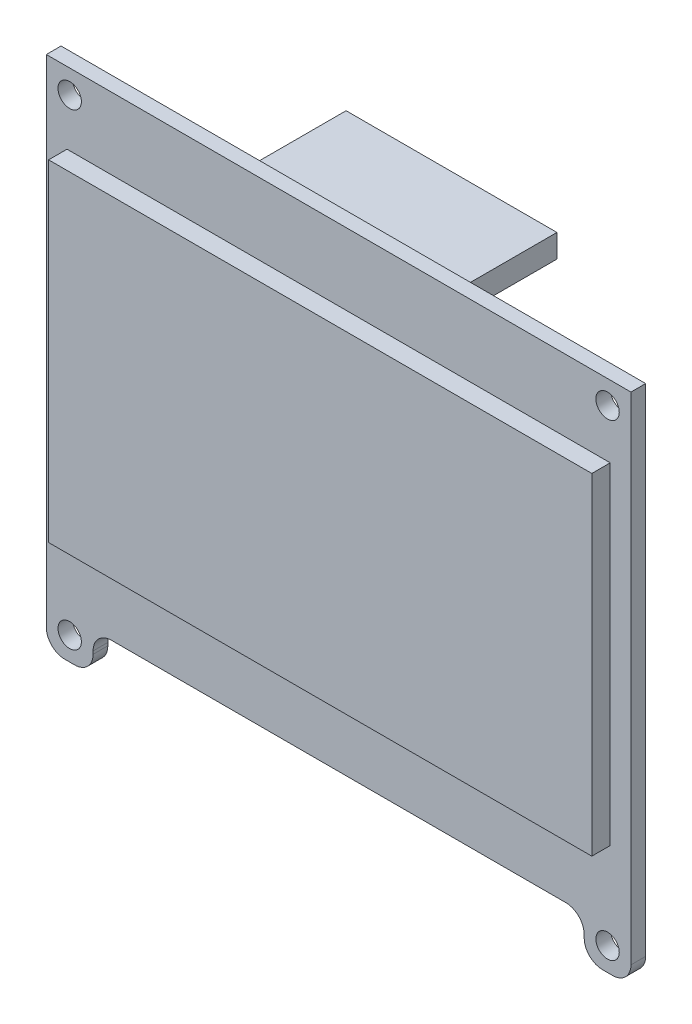
ISO-10303-21;
HEADER;
FILE_DESCRIPTION(('STEP AP214'),'2;1');
FILE_NAME('part.step','',(''),(''),'','','');
FILE_SCHEMA(('AUTOMOTIVE_DESIGN { 1 0 10303 214 1 1 1 1 }'));
ENDSEC;
DATA;
#1=APPLICATION_CONTEXT('core data for automotive mechanical design processes');
#2=APPLICATION_PROTOCOL_DEFINITION('international standard','automotive_design',2000,#1);
#3=PRODUCT_CONTEXT('',#1,'mechanical');
#4=PRODUCT('Part','Part','',(#3));
#5=PRODUCT_RELATED_PRODUCT_CATEGORY('part','',(#4));
#6=PRODUCT_DEFINITION_FORMATION('','',#4);
#7=PRODUCT_DEFINITION_CONTEXT('part definition',#1,'design');
#8=PRODUCT_DEFINITION('design','',#6,#7);
#9=PRODUCT_DEFINITION_SHAPE('','',#8);
#10=(LENGTH_UNIT() NAMED_UNIT(*) SI_UNIT(.MILLI.,.METRE.));
#11=(NAMED_UNIT(*) PLANE_ANGLE_UNIT() SI_UNIT($,.RADIAN.));
#12=(NAMED_UNIT(*) SI_UNIT($,.STERADIAN.) SOLID_ANGLE_UNIT());
#13=UNCERTAINTY_MEASURE_WITH_UNIT(LENGTH_MEASURE(1.E-05),#10,'distance_accuracy_value','');
#14=(GEOMETRIC_REPRESENTATION_CONTEXT(3) GLOBAL_UNCERTAINTY_ASSIGNED_CONTEXT((#13)) GLOBAL_UNIT_ASSIGNED_CONTEXT((#10,
#11,#12)) REPRESENTATION_CONTEXT('',''));
#15=CARTESIAN_POINT('',(0.,0.,0.));
#16=DIRECTION('',(0.,0.,1.));
#17=DIRECTION('',(1.,0.,0.));
#18=AXIS2_PLACEMENT_3D('',#15,#16,#17);
#19=CARTESIAN_POINT('',(0.,0.,0.));
#20=DIRECTION('',(0.,0.,1.));
#21=DIRECTION('',(1.,0.,0.));
#22=AXIS2_PLACEMENT_3D('',#19,#20,#21);
#23=PLANE('',#22);
#24=DIRECTION('',(0.,-1.,0.));
#25=VECTOR('',#24,1.);
#26=CARTESIAN_POINT('',(0.,0.,0.));
#27=LINE('',#26,#25);
#28=CARTESIAN_POINT('',(0.,0.,0.));
#29=VERTEX_POINT('',#28);
#30=CARTESIAN_POINT('',(0.,-53.88,0.));
#31=VERTEX_POINT('',#30);
#32=EDGE_CURVE('E352',#29,#31,#27,.T.);
#33=ORIENTED_EDGE('',*,*,#32,.F.);
#34=DIRECTION('',(1.,0.,0.));
#35=VECTOR('',#34,1.);
#36=CARTESIAN_POINT('',(0.,0.,0.));
#37=LINE('',#36,#35);
#38=CARTESIAN_POINT('',(63.5,0.,0.));
#39=VERTEX_POINT('',#38);
#40=EDGE_CURVE('E277',#29,#39,#37,.T.);
#41=ORIENTED_EDGE('',*,*,#40,.T.);
#42=DIRECTION('',(0.,-1.,0.));
#43=VECTOR('',#42,1.);
#44=CARTESIAN_POINT('',(63.5,0.,0.));
#45=LINE('',#44,#43);
#46=CARTESIAN_POINT('',(63.5,-53.88,0.));
#47=VERTEX_POINT('',#46);
#48=EDGE_CURVE('E394',#39,#47,#45,.T.);
#49=ORIENTED_EDGE('',*,*,#48,.T.);
#50=CARTESIAN_POINT('',(61.5,-53.88,0.));
#51=DIRECTION('',(0.,0.,1.));
#52=DIRECTION('',(1.,0.,0.));
#53=AXIS2_PLACEMENT_3D('',#50,#51,#52);
#54=CIRCLE('',#53,2.);
#55=CARTESIAN_POINT('',(61.5,-55.88,0.));
#56=VERTEX_POINT('',#55);
#57=EDGE_CURVE('E386',#56,#47,#54,.T.);
#58=ORIENTED_EDGE('',*,*,#57,.F.);
#59=DIRECTION('',(1.,0.,0.));
#60=VECTOR('',#59,1.);
#61=CARTESIAN_POINT('',(0.,-55.88,0.));
#62=LINE('',#61,#60);
#63=CARTESIAN_POINT('',(60.42,-55.88,0.));
#64=VERTEX_POINT('',#63);
#65=EDGE_CURVE('E387',#64,#56,#62,.T.);
#66=ORIENTED_EDGE('',*,*,#65,.F.);
#67=CARTESIAN_POINT('',(60.42,-53.88,0.));
#68=DIRECTION('',(0.,0.,1.));
#69=DIRECTION('',(1.,0.,0.));
#70=AXIS2_PLACEMENT_3D('',#67,#68,#69);
#71=CIRCLE('',#70,2.);
#72=CARTESIAN_POINT('',(58.42,-53.88,0.));
#73=VERTEX_POINT('',#72);
#74=EDGE_CURVE('E382',#73,#64,#71,.T.);
#75=ORIENTED_EDGE('',*,*,#74,.F.);
#76=DIRECTION('',(0.,1.,0.));
#77=VECTOR('',#76,1.);
#78=CARTESIAN_POINT('',(58.42,0.,0.));
#79=LINE('',#78,#77);
#80=CARTESIAN_POINT('',(58.42,-53.562,0.));
#81=VERTEX_POINT('',#80);
#82=EDGE_CURVE('E377',#73,#81,#79,.T.);
#83=ORIENTED_EDGE('',*,*,#82,.T.);
#84=CARTESIAN_POINT('',(56.42,-53.562,0.));
#85=DIRECTION('',(0.,0.,1.));
#86=DIRECTION('',(1.,0.,0.));
#87=AXIS2_PLACEMENT_3D('',#84,#85,#86);
#88=CIRCLE('',#87,2.);
#89=CARTESIAN_POINT('',(56.42,-51.562,0.));
#90=VERTEX_POINT('',#89);
#91=EDGE_CURVE('E374',#90,#81,#88,.F.);
#92=ORIENTED_EDGE('',*,*,#91,.F.);
#93=DIRECTION('',(1.,0.,0.));
#94=VECTOR('',#93,1.);
#95=CARTESIAN_POINT('',(0.,-51.562,0.));
#96=LINE('',#95,#94);
#97=CARTESIAN_POINT('',(7.08000000000002,-51.562,0.));
#98=VERTEX_POINT('',#97);
#99=EDGE_CURVE('E375',#98,#90,#96,.T.);
#100=ORIENTED_EDGE('',*,*,#99,.F.);
#101=CARTESIAN_POINT('',(7.08,-53.562,0.));
#102=DIRECTION('',(0.,0.,1.));
#103=DIRECTION('',(1.,0.,0.));
#104=AXIS2_PLACEMENT_3D('',#101,#102,#103);
#105=CIRCLE('',#104,2.);
#106=CARTESIAN_POINT('',(5.08,-53.562,0.));
#107=VERTEX_POINT('',#106);
#108=EDGE_CURVE('E369',#107,#98,#105,.F.);
#109=ORIENTED_EDGE('',*,*,#108,.F.);
#110=DIRECTION('',(0.,1.,0.));
#111=VECTOR('',#110,1.);
#112=CARTESIAN_POINT('',(5.08,0.,0.));
#113=LINE('',#112,#111);
#114=CARTESIAN_POINT('',(5.08,-53.88,0.));
#115=VERTEX_POINT('',#114);
#116=EDGE_CURVE('E368',#115,#107,#113,.T.);
#117=ORIENTED_EDGE('',*,*,#116,.F.);
#118=CARTESIAN_POINT('',(3.08,-53.88,0.));
#119=DIRECTION('',(0.,0.,1.));
#120=DIRECTION('',(1.,0.,0.));
#121=AXIS2_PLACEMENT_3D('',#118,#119,#120);
#122=CIRCLE('',#121,2.);
#123=CARTESIAN_POINT('',(3.07999999999999,-55.88,0.));
#124=VERTEX_POINT('',#123);
#125=EDGE_CURVE('E362',#115,#124,#122,.F.);
#126=ORIENTED_EDGE('',*,*,#125,.T.);
#127=DIRECTION('',(1.,0.,0.));
#128=VECTOR('',#127,1.);
#129=CARTESIAN_POINT('',(0.,-55.88,0.));
#130=LINE('',#129,#128);
#131=CARTESIAN_POINT('',(2.00000000000002,-55.88,0.));
#132=VERTEX_POINT('',#131);
#133=EDGE_CURVE('E356',#132,#124,#130,.T.);
#134=ORIENTED_EDGE('',*,*,#133,.F.);
#135=CARTESIAN_POINT('',(2.00000000000001,-53.88,0.));
#136=DIRECTION('',(0.,0.,1.));
#137=DIRECTION('',(1.,0.,0.));
#138=AXIS2_PLACEMENT_3D('',#135,#136,#137);
#139=CIRCLE('',#138,2.);
#140=EDGE_CURVE('E353',#31,#132,#139,.T.);
#141=ORIENTED_EDGE('',*,*,#140,.F.);
#142=EDGE_LOOP('',(#33,#41,#49,#58,#66,#75,#83,#92,#100,#109,#117,#126,#134,#141));
#143=FACE_BOUND('',#142,.T.);
#144=CARTESIAN_POINT('',(2.54000000000001,-53.34,0.));
#145=DIRECTION('',(0.,0.,1.));
#146=DIRECTION('',(1.,0.,0.));
#147=AXIS2_PLACEMENT_3D('',#144,#145,#146);
#148=CIRCLE('',#147,1.27);
#149=CARTESIAN_POINT('',(3.81000000000001,-53.34,0.));
#150=VERTEX_POINT('',#149);
#151=EDGE_CURVE('E350',#150,#150,#148,.T.);
#152=ORIENTED_EDGE('',*,*,#151,.T.);
#153=EDGE_LOOP('',(#152));
#154=FACE_BOUND('',#153,.T.);
#155=CARTESIAN_POINT('',(60.96,-53.34,0.));
#156=DIRECTION('',(0.,0.,1.));
#157=DIRECTION('',(1.,0.,0.));
#158=AXIS2_PLACEMENT_3D('',#155,#156,#157);
#159=CIRCLE('',#158,1.26999999999999);
#160=CARTESIAN_POINT('',(62.23,-53.34,0.));
#161=VERTEX_POINT('',#160);
#162=EDGE_CURVE('E341',#161,#161,#159,.T.);
#163=ORIENTED_EDGE('',*,*,#162,.T.);
#164=EDGE_LOOP('',(#163));
#165=FACE_BOUND('',#164,.T.);
#166=CARTESIAN_POINT('',(60.96,-2.54,0.));
#167=DIRECTION('',(0.,0.,1.));
#168=DIRECTION('',(1.,0.,0.));
#169=AXIS2_PLACEMENT_3D('',#166,#167,#168);
#170=CIRCLE('',#169,1.26999999999999);
#171=CARTESIAN_POINT('',(62.23,-2.54,0.));
#172=VERTEX_POINT('',#171);
#173=EDGE_CURVE('E336',#172,#172,#170,.T.);
#174=ORIENTED_EDGE('',*,*,#173,.T.);
#175=EDGE_LOOP('',(#174));
#176=FACE_BOUND('',#175,.T.);
#177=CARTESIAN_POINT('',(2.54000000000001,-2.54,0.));
#178=DIRECTION('',(0.,0.,1.));
#179=DIRECTION('',(1.,0.,0.));
#180=AXIS2_PLACEMENT_3D('',#177,#178,#179);
#181=CIRCLE('',#180,1.27);
#182=CARTESIAN_POINT('',(3.81000000000001,-2.54,0.));
#183=VERTEX_POINT('',#182);
#184=EDGE_CURVE('E269',#183,#183,#181,.T.);
#185=ORIENTED_EDGE('',*,*,#184,.T.);
#186=EDGE_LOOP('',(#185));
#187=FACE_BOUND('',#186,.T.);
#188=DIRECTION('',(0.,1.,0.));
#189=VECTOR('',#188,1.);
#190=CARTESIAN_POINT('',(20.3,-1.26637928800232,0.));
#191=LINE('',#190,#189);
#192=CARTESIAN_POINT('',(20.3,-3.77637928800232,0.));
#193=VERTEX_POINT('',#192);
#194=CARTESIAN_POINT('',(20.3,-1.26637928800232,0.));
#195=VERTEX_POINT('',#194);
#196=EDGE_CURVE('E64',#193,#195,#191,.T.);
#197=ORIENTED_EDGE('',*,*,#196,.F.);
#198=DIRECTION('',(-1.,0.,0.));
#199=VECTOR('',#198,1.);
#200=CARTESIAN_POINT('',(43.2,-3.77637928800232,0.));
#201=LINE('',#200,#199);
#202=CARTESIAN_POINT('',(43.2,-3.77637928800232,0.));
#203=VERTEX_POINT('',#202);
#204=EDGE_CURVE('E70',#203,#193,#201,.T.);
#205=ORIENTED_EDGE('',*,*,#204,.F.);
#206=DIRECTION('',(0.,-1.,0.));
#207=VECTOR('',#206,1.);
#208=CARTESIAN_POINT('',(43.2,-1.26637928800232,0.));
#209=LINE('',#208,#207);
#210=CARTESIAN_POINT('',(43.2,-1.26637928800232,0.));
#211=VERTEX_POINT('',#210);
#212=EDGE_CURVE('E718',#211,#203,#209,.T.);
#213=ORIENTED_EDGE('',*,*,#212,.F.);
#214=DIRECTION('',(1.,0.,0.));
#215=VECTOR('',#214,1.);
#216=CARTESIAN_POINT('',(43.2,-1.26637928800232,0.));
#217=LINE('',#216,#215);
#218=EDGE_CURVE('E727',#195,#211,#217,.T.);
#219=ORIENTED_EDGE('',*,*,#218,.F.);
#220=EDGE_LOOP('',(#197,#205,#213,#219));
#221=FACE_BOUND('',#220,.T.);
#222=ADVANCED_FACE('F50',(#143,#154,#165,#176,#187,#221),#23,.F.);
#223=CARTESIAN_POINT('',(0.,0.,1.6));
#224=DIRECTION('',(1.,0.,0.));
#225=DIRECTION('',(0.,1.,0.));
#226=AXIS2_PLACEMENT_3D('',#223,#224,#225);
#227=PLANE('',#226);
#228=ORIENTED_EDGE('',*,*,#32,.T.);
#229=DIRECTION('',(0.,0.,-1.));
#230=VECTOR('',#229,1.);
#231=CARTESIAN_POINT('',(0.,-53.88,1.6));
#232=LINE('',#231,#230);
#233=CARTESIAN_POINT('',(0.,-53.88,1.6));
#234=VERTEX_POINT('',#233);
#235=EDGE_CURVE('E12',#234,#31,#232,.T.);
#236=ORIENTED_EDGE('',*,*,#235,.F.);
#237=DIRECTION('',(0.,-1.,0.));
#238=VECTOR('',#237,1.);
#239=CARTESIAN_POINT('',(0.,0.,1.6));
#240=LINE('',#239,#238);
#241=CARTESIAN_POINT('',(0.,0.,1.6));
#242=VERTEX_POINT('',#241);
#243=EDGE_CURVE('E286',#242,#234,#240,.T.);
#244=ORIENTED_EDGE('',*,*,#243,.F.);
#245=DIRECTION('',(0.,0.,-1.));
#246=VECTOR('',#245,1.);
#247=CARTESIAN_POINT('',(0.,0.,1.6));
#248=LINE('',#247,#246);
#249=EDGE_CURVE('E333',#242,#29,#248,.T.);
#250=ORIENTED_EDGE('',*,*,#249,.T.);
#251=EDGE_LOOP('',(#228,#236,#244,#250));
#252=FACE_BOUND('',#251,.T.);
#253=ADVANCED_FACE('F468',(#252),#227,.F.);
#254=CARTESIAN_POINT('',(2.00000000000001,-53.88,1.6));
#255=DIRECTION('',(0.,0.,-1.));
#256=DIRECTION('',(-1.,0.,0.));
#257=AXIS2_PLACEMENT_3D('',#254,#255,#256);
#258=CYLINDRICAL_SURFACE('',#257,2.);
#259=ORIENTED_EDGE('',*,*,#140,.T.);
#260=DIRECTION('',(0.,0.,-1.));
#261=VECTOR('',#260,1.);
#262=CARTESIAN_POINT('',(2.00000000000002,-55.88,1.6));
#263=LINE('',#262,#261);
#264=CARTESIAN_POINT('',(2.00000000000002,-55.88,1.6));
#265=VERTEX_POINT('',#264);
#266=EDGE_CURVE('E57',#265,#132,#263,.T.);
#267=ORIENTED_EDGE('',*,*,#266,.F.);
#268=CARTESIAN_POINT('',(2.00000000000001,-53.88,1.6));
#269=DIRECTION('',(0.,0.,1.));
#270=DIRECTION('',(1.,0.,0.));
#271=AXIS2_PLACEMENT_3D('',#268,#269,#270);
#272=CIRCLE('',#271,2.);
#273=EDGE_CURVE('E295',#234,#265,#272,.T.);
#274=ORIENTED_EDGE('',*,*,#273,.F.);
#275=ORIENTED_EDGE('',*,*,#235,.T.);
#276=EDGE_LOOP('',(#259,#267,#274,#275));
#277=FACE_BOUND('',#276,.T.);
#278=ADVANCED_FACE('F461',(#277),#258,.T.);
#279=CARTESIAN_POINT('',(0.,-55.88,1.6));
#280=DIRECTION('',(0.,1.,0.));
#281=DIRECTION('',(0.,0.,1.));
#282=AXIS2_PLACEMENT_3D('',#279,#280,#281);
#283=PLANE('',#282);
#284=ORIENTED_EDGE('',*,*,#133,.T.);
#285=DIRECTION('',(0.,0.,-1.));
#286=VECTOR('',#285,1.);
#287=CARTESIAN_POINT('',(3.07999999999999,-55.88,1.6));
#288=LINE('',#287,#286);
#289=CARTESIAN_POINT('',(3.07999999999999,-55.88,1.6));
#290=VERTEX_POINT('',#289);
#291=EDGE_CURVE('E440',#290,#124,#288,.T.);
#292=ORIENTED_EDGE('',*,*,#291,.F.);
#293=DIRECTION('',(1.,0.,0.));
#294=VECTOR('',#293,1.);
#295=CARTESIAN_POINT('',(0.,-55.88,1.6));
#296=LINE('',#295,#294);
#297=EDGE_CURVE('E293',#265,#290,#296,.T.);
#298=ORIENTED_EDGE('',*,*,#297,.F.);
#299=ORIENTED_EDGE('',*,*,#266,.T.);
#300=EDGE_LOOP('',(#284,#292,#298,#299));
#301=FACE_BOUND('',#300,.T.);
#302=ADVANCED_FACE('F443',(#301),#283,.F.);
#303=CARTESIAN_POINT('',(3.08,-53.88,1.6));
#304=DIRECTION('',(0.,0.,-1.));
#305=DIRECTION('',(-1.,0.,0.));
#306=AXIS2_PLACEMENT_3D('',#303,#304,#305);
#307=CYLINDRICAL_SURFACE('',#306,2.);
#308=ORIENTED_EDGE('',*,*,#125,.F.);
#309=DIRECTION('',(0.,0.,-1.));
#310=VECTOR('',#309,1.);
#311=CARTESIAN_POINT('',(5.08,-53.88,1.6));
#312=LINE('',#311,#310);
#313=CARTESIAN_POINT('',(5.08,-53.88,1.6));
#314=VERTEX_POINT('',#313);
#315=EDGE_CURVE('E432',#314,#115,#312,.T.);
#316=ORIENTED_EDGE('',*,*,#315,.F.);
#317=CARTESIAN_POINT('',(3.08,-53.88,1.6));
#318=DIRECTION('',(0.,0.,1.));
#319=DIRECTION('',(1.,0.,0.));
#320=AXIS2_PLACEMENT_3D('',#317,#318,#319);
#321=CIRCLE('',#320,2.);
#322=EDGE_CURVE('E299',#314,#290,#321,.F.);
#323=ORIENTED_EDGE('',*,*,#322,.T.);
#324=ORIENTED_EDGE('',*,*,#291,.T.);
#325=EDGE_LOOP('',(#308,#316,#323,#324));
#326=FACE_BOUND('',#325,.T.);
#327=ADVANCED_FACE('F452',(#326),#307,.T.);
#328=CARTESIAN_POINT('',(5.08,0.,1.6));
#329=DIRECTION('',(-1.,0.,0.));
#330=DIRECTION('',(0.,0.,1.));
#331=AXIS2_PLACEMENT_3D('',#328,#329,#330);
#332=PLANE('',#331);
#333=ORIENTED_EDGE('',*,*,#116,.T.);
#334=DIRECTION('',(0.,0.,-1.));
#335=VECTOR('',#334,1.);
#336=CARTESIAN_POINT('',(5.08,-53.562,1.6));
#337=LINE('',#336,#335);
#338=CARTESIAN_POINT('',(5.08,-53.562,1.6));
#339=VERTEX_POINT('',#338);
#340=EDGE_CURVE('E429',#339,#107,#337,.T.);
#341=ORIENTED_EDGE('',*,*,#340,.F.);
#342=DIRECTION('',(0.,1.,0.));
#343=VECTOR('',#342,1.);
#344=CARTESIAN_POINT('',(5.08,0.,1.6));
#345=LINE('',#344,#343);
#346=EDGE_CURVE('E305',#314,#339,#345,.T.);
#347=ORIENTED_EDGE('',*,*,#346,.F.);
#348=ORIENTED_EDGE('',*,*,#315,.T.);
#349=EDGE_LOOP('',(#333,#341,#347,#348));
#350=FACE_BOUND('',#349,.T.);
#351=ADVANCED_FACE('F506',(#350),#332,.F.);
#352=CARTESIAN_POINT('',(7.08,-53.562,1.6));
#353=DIRECTION('',(0.,0.,-1.));
#354=DIRECTION('',(-1.,0.,0.));
#355=AXIS2_PLACEMENT_3D('',#352,#353,#354);
#356=CYLINDRICAL_SURFACE('',#355,2.);
#357=ORIENTED_EDGE('',*,*,#108,.T.);
#358=DIRECTION('',(0.,0.,-1.));
#359=VECTOR('',#358,1.);
#360=CARTESIAN_POINT('',(7.08000000000002,-51.562,1.6));
#361=LINE('',#360,#359);
#362=CARTESIAN_POINT('',(7.08000000000002,-51.562,1.6));
#363=VERTEX_POINT('',#362);
#364=EDGE_CURVE('E426',#363,#98,#361,.T.);
#365=ORIENTED_EDGE('',*,*,#364,.F.);
#366=CARTESIAN_POINT('',(7.08,-53.562,1.6));
#367=DIRECTION('',(0.,0.,1.));
#368=DIRECTION('',(1.,0.,0.));
#369=AXIS2_PLACEMENT_3D('',#366,#367,#368);
#370=CIRCLE('',#369,2.);
#371=EDGE_CURVE('E302',#339,#363,#370,.F.);
#372=ORIENTED_EDGE('',*,*,#371,.F.);
#373=ORIENTED_EDGE('',*,*,#340,.T.);
#374=EDGE_LOOP('',(#357,#365,#372,#373));
#375=FACE_BOUND('',#374,.T.);
#376=ADVANCED_FACE('F508',(#375),#356,.F.);
#377=CARTESIAN_POINT('',(0.,-51.562,1.6));
#378=DIRECTION('',(0.,1.,0.));
#379=DIRECTION('',(0.,0.,1.));
#380=AXIS2_PLACEMENT_3D('',#377,#378,#379);
#381=PLANE('',#380);
#382=ORIENTED_EDGE('',*,*,#99,.T.);
#383=DIRECTION('',(0.,0.,-1.));
#384=VECTOR('',#383,1.);
#385=CARTESIAN_POINT('',(56.42,-51.562,1.6));
#386=LINE('',#385,#384);
#387=CARTESIAN_POINT('',(56.42,-51.562,1.6));
#388=VERTEX_POINT('',#387);
#389=EDGE_CURVE('E425',#388,#90,#386,.T.);
#390=ORIENTED_EDGE('',*,*,#389,.F.);
#391=DIRECTION('',(1.,0.,0.));
#392=VECTOR('',#391,1.);
#393=CARTESIAN_POINT('',(0.,-51.562,1.6));
#394=LINE('',#393,#392);
#395=EDGE_CURVE('E306',#363,#388,#394,.T.);
#396=ORIENTED_EDGE('',*,*,#395,.F.);
#397=ORIENTED_EDGE('',*,*,#364,.T.);
#398=EDGE_LOOP('',(#382,#390,#396,#397));
#399=FACE_BOUND('',#398,.T.);
#400=ADVANCED_FACE('F502',(#399),#381,.F.);
#401=CARTESIAN_POINT('',(56.42,-53.562,1.6));
#402=DIRECTION('',(0.,0.,-1.));
#403=DIRECTION('',(-1.,0.,0.));
#404=AXIS2_PLACEMENT_3D('',#401,#402,#403);
#405=CYLINDRICAL_SURFACE('',#404,2.);
#406=ORIENTED_EDGE('',*,*,#91,.T.);
#407=DIRECTION('',(0.,0.,-1.));
#408=VECTOR('',#407,1.);
#409=CARTESIAN_POINT('',(58.42,-53.562,1.6));
#410=LINE('',#409,#408);
#411=CARTESIAN_POINT('',(58.42,-53.562,1.6));
#412=VERTEX_POINT('',#411);
#413=EDGE_CURVE('E420',#412,#81,#410,.T.);
#414=ORIENTED_EDGE('',*,*,#413,.F.);
#415=CARTESIAN_POINT('',(56.42,-53.562,1.6));
#416=DIRECTION('',(0.,0.,1.));
#417=DIRECTION('',(1.,0.,0.));
#418=AXIS2_PLACEMENT_3D('',#415,#416,#417);
#419=CIRCLE('',#418,2.);
#420=EDGE_CURVE('E313',#388,#412,#419,.F.);
#421=ORIENTED_EDGE('',*,*,#420,.F.);
#422=ORIENTED_EDGE('',*,*,#389,.T.);
#423=EDGE_LOOP('',(#406,#414,#421,#422));
#424=FACE_BOUND('',#423,.T.);
#425=ADVANCED_FACE('F500',(#424),#405,.F.);
#426=CARTESIAN_POINT('',(58.42,0.,1.6));
#427=DIRECTION('',(-1.,0.,0.));
#428=DIRECTION('',(0.,0.,1.));
#429=AXIS2_PLACEMENT_3D('',#426,#427,#428);
#430=PLANE('',#429);
#431=ORIENTED_EDGE('',*,*,#82,.F.);
#432=DIRECTION('',(0.,0.,-1.));
#433=VECTOR('',#432,1.);
#434=CARTESIAN_POINT('',(58.42,-53.88,1.6));
#435=LINE('',#434,#433);
#436=CARTESIAN_POINT('',(58.42,-53.88,1.6));
#437=VERTEX_POINT('',#436);
#438=EDGE_CURVE('E418',#437,#73,#435,.T.);
#439=ORIENTED_EDGE('',*,*,#438,.F.);
#440=DIRECTION('',(0.,1.,0.));
#441=VECTOR('',#440,1.);
#442=CARTESIAN_POINT('',(58.42,0.,1.6));
#443=LINE('',#442,#441);
#444=EDGE_CURVE('E314',#437,#412,#443,.T.);
#445=ORIENTED_EDGE('',*,*,#444,.T.);
#446=ORIENTED_EDGE('',*,*,#413,.T.);
#447=EDGE_LOOP('',(#431,#439,#445,#446));
#448=FACE_BOUND('',#447,.T.);
#449=ADVANCED_FACE('F492',(#448),#430,.T.);
#450=CARTESIAN_POINT('',(60.42,-53.88,1.6));
#451=DIRECTION('',(0.,0.,-1.));
#452=DIRECTION('',(-1.,0.,0.));
#453=AXIS2_PLACEMENT_3D('',#450,#451,#452);
#454=CYLINDRICAL_SURFACE('',#453,2.);
#455=ORIENTED_EDGE('',*,*,#74,.T.);
#456=DIRECTION('',(0.,0.,-1.));
#457=VECTOR('',#456,1.);
#458=CARTESIAN_POINT('',(60.42,-55.88,1.6));
#459=LINE('',#458,#457);
#460=CARTESIAN_POINT('',(60.42,-55.88,1.6));
#461=VERTEX_POINT('',#460);
#462=EDGE_CURVE('E415',#461,#64,#459,.T.);
#463=ORIENTED_EDGE('',*,*,#462,.F.);
#464=CARTESIAN_POINT('',(60.42,-53.88,1.6));
#465=DIRECTION('',(0.,0.,1.));
#466=DIRECTION('',(1.,0.,0.));
#467=AXIS2_PLACEMENT_3D('',#464,#465,#466);
#468=CIRCLE('',#467,2.);
#469=EDGE_CURVE('E318',#437,#461,#468,.T.);
#470=ORIENTED_EDGE('',*,*,#469,.F.);
#471=ORIENTED_EDGE('',*,*,#438,.T.);
#472=EDGE_LOOP('',(#455,#463,#470,#471));
#473=FACE_BOUND('',#472,.T.);
#474=ADVANCED_FACE('F488',(#473),#454,.T.);
#475=CARTESIAN_POINT('',(0.,-55.88,1.6));
#476=DIRECTION('',(0.,1.,0.));
#477=DIRECTION('',(0.,0.,1.));
#478=AXIS2_PLACEMENT_3D('',#475,#476,#477);
#479=PLANE('',#478);
#480=ORIENTED_EDGE('',*,*,#65,.T.);
#481=DIRECTION('',(0.,0.,-1.));
#482=VECTOR('',#481,1.);
#483=CARTESIAN_POINT('',(61.5,-55.88,1.6));
#484=LINE('',#483,#482);
#485=CARTESIAN_POINT('',(61.5,-55.88,1.6));
#486=VERTEX_POINT('',#485);
#487=EDGE_CURVE('E409',#486,#56,#484,.T.);
#488=ORIENTED_EDGE('',*,*,#487,.F.);
#489=DIRECTION('',(1.,0.,0.));
#490=VECTOR('',#489,1.);
#491=CARTESIAN_POINT('',(0.,-55.88,1.6));
#492=LINE('',#491,#490);
#493=EDGE_CURVE('E321',#461,#486,#492,.T.);
#494=ORIENTED_EDGE('',*,*,#493,.F.);
#495=ORIENTED_EDGE('',*,*,#462,.T.);
#496=EDGE_LOOP('',(#480,#488,#494,#495));
#497=FACE_BOUND('',#496,.T.);
#498=ADVANCED_FACE('F482',(#497),#479,.F.);
#499=CARTESIAN_POINT('',(61.5,-53.88,1.6));
#500=DIRECTION('',(0.,0.,-1.));
#501=DIRECTION('',(-1.,0.,0.));
#502=AXIS2_PLACEMENT_3D('',#499,#500,#501);
#503=CYLINDRICAL_SURFACE('',#502,2.);
#504=ORIENTED_EDGE('',*,*,#57,.T.);
#505=DIRECTION('',(0.,0.,-1.));
#506=VECTOR('',#505,1.);
#507=CARTESIAN_POINT('',(63.5,-53.88,1.6));
#508=LINE('',#507,#506);
#509=CARTESIAN_POINT('',(63.5,-53.88,1.6));
#510=VERTEX_POINT('',#509);
#511=EDGE_CURVE('E403',#510,#47,#508,.T.);
#512=ORIENTED_EDGE('',*,*,#511,.F.);
#513=CARTESIAN_POINT('',(61.5,-53.88,1.6));
#514=DIRECTION('',(0.,0.,1.));
#515=DIRECTION('',(1.,0.,0.));
#516=AXIS2_PLACEMENT_3D('',#513,#514,#515);
#517=CIRCLE('',#516,2.);
#518=EDGE_CURVE('E322',#486,#510,#517,.T.);
#519=ORIENTED_EDGE('',*,*,#518,.F.);
#520=ORIENTED_EDGE('',*,*,#487,.T.);
#521=EDGE_LOOP('',(#504,#512,#519,#520));
#522=FACE_BOUND('',#521,.T.);
#523=ADVANCED_FACE('F479',(#522),#503,.T.);
#524=CARTESIAN_POINT('',(63.5,0.,1.6));
#525=DIRECTION('',(1.,0.,0.));
#526=DIRECTION('',(0.,0.,-1.));
#527=AXIS2_PLACEMENT_3D('',#524,#525,#526);
#528=PLANE('',#527);
#529=ORIENTED_EDGE('',*,*,#48,.F.);
#530=DIRECTION('',(0.,0.,-1.));
#531=VECTOR('',#530,1.);
#532=CARTESIAN_POINT('',(63.5,0.,1.6));
#533=LINE('',#532,#531);
#534=CARTESIAN_POINT('',(63.5,0.,1.6));
#535=VERTEX_POINT('',#534);
#536=EDGE_CURVE('E405',#535,#39,#533,.T.);
#537=ORIENTED_EDGE('',*,*,#536,.F.);
#538=DIRECTION('',(0.,-1.,0.));
#539=VECTOR('',#538,1.);
#540=CARTESIAN_POINT('',(63.5,0.,1.6));
#541=LINE('',#540,#539);
#542=EDGE_CURVE('E330',#535,#510,#541,.T.);
#543=ORIENTED_EDGE('',*,*,#542,.T.);
#544=ORIENTED_EDGE('',*,*,#511,.T.);
#545=EDGE_LOOP('',(#529,#537,#543,#544));
#546=FACE_BOUND('',#545,.T.);
#547=ADVANCED_FACE('F471',(#546),#528,.T.);
#548=CARTESIAN_POINT('',(2.54000000000001,-53.34,1.6));
#549=DIRECTION('',(0.,0.,-1.));
#550=DIRECTION('',(-1.,0.,0.));
#551=AXIS2_PLACEMENT_3D('',#548,#549,#550);
#552=CYLINDRICAL_SURFACE('',#551,1.27);
#553=CARTESIAN_POINT('',(2.54000000000001,-53.34,1.6));
#554=DIRECTION('',(0.,0.,1.));
#555=DIRECTION('',(1.,0.,0.));
#556=AXIS2_PLACEMENT_3D('',#553,#554,#555);
#557=CIRCLE('',#556,1.27);
#558=CARTESIAN_POINT('',(3.81000000000001,-53.34,1.6));
#559=VERTEX_POINT('',#558);
#560=EDGE_CURVE('E281',#559,#559,#557,.T.);
#561=ORIENTED_EDGE('',*,*,#560,.T.);
#562=EDGE_LOOP('',(#561));
#563=FACE_BOUND('',#562,.T.);
#564=ORIENTED_EDGE('',*,*,#151,.F.);
#565=EDGE_LOOP('',(#564));
#566=FACE_BOUND('',#565,.T.);
#567=ADVANCED_FACE('F535',(#563,#566),#552,.F.);
#568=CARTESIAN_POINT('',(60.96,-53.34,1.6));
#569=DIRECTION('',(0.,0.,-1.));
#570=DIRECTION('',(-1.,0.,0.));
#571=AXIS2_PLACEMENT_3D('',#568,#569,#570);
#572=CYLINDRICAL_SURFACE('',#571,1.26999999999999);
#573=CARTESIAN_POINT('',(60.96,-53.34,1.6));
#574=DIRECTION('',(0.,0.,1.));
#575=DIRECTION('',(1.,0.,0.));
#576=AXIS2_PLACEMENT_3D('',#573,#574,#575);
#577=CIRCLE('',#576,1.26999999999999);
#578=CARTESIAN_POINT('',(62.23,-53.34,1.6));
#579=VERTEX_POINT('',#578);
#580=EDGE_CURVE('E278',#579,#579,#577,.T.);
#581=ORIENTED_EDGE('',*,*,#580,.T.);
#582=EDGE_LOOP('',(#581));
#583=FACE_BOUND('',#582,.T.);
#584=ORIENTED_EDGE('',*,*,#162,.F.);
#585=EDGE_LOOP('',(#584));
#586=FACE_BOUND('',#585,.T.);
#587=ADVANCED_FACE('F584',(#583,#586),#572,.F.);
#588=CARTESIAN_POINT('',(60.96,-2.54,1.6));
#589=DIRECTION('',(0.,0.,-1.));
#590=DIRECTION('',(-1.,0.,0.));
#591=AXIS2_PLACEMENT_3D('',#588,#589,#590);
#592=CYLINDRICAL_SURFACE('',#591,1.26999999999999);
#593=CARTESIAN_POINT('',(60.96,-2.54,1.6));
#594=DIRECTION('',(0.,0.,1.));
#595=DIRECTION('',(1.,0.,0.));
#596=AXIS2_PLACEMENT_3D('',#593,#594,#595);
#597=CIRCLE('',#596,1.26999999999999);
#598=CARTESIAN_POINT('',(62.23,-2.54,1.6));
#599=VERTEX_POINT('',#598);
#600=EDGE_CURVE('E274',#599,#599,#597,.T.);
#601=ORIENTED_EDGE('',*,*,#600,.T.);
#602=EDGE_LOOP('',(#601));
#603=FACE_BOUND('',#602,.T.);
#604=ORIENTED_EDGE('',*,*,#173,.F.);
#605=EDGE_LOOP('',(#604));
#606=FACE_BOUND('',#605,.T.);
#607=ADVANCED_FACE('F592',(#603,#606),#592,.F.);
#608=CARTESIAN_POINT('',(2.54000000000001,-2.54,1.6));
#609=DIRECTION('',(0.,0.,-1.));
#610=DIRECTION('',(-1.,0.,0.));
#611=AXIS2_PLACEMENT_3D('',#608,#609,#610);
#612=CYLINDRICAL_SURFACE('',#611,1.27);
#613=CARTESIAN_POINT('',(2.54000000000001,-2.54,1.6));
#614=DIRECTION('',(0.,0.,1.));
#615=DIRECTION('',(1.,0.,0.));
#616=AXIS2_PLACEMENT_3D('',#613,#614,#615);
#617=CIRCLE('',#616,1.27);
#618=CARTESIAN_POINT('',(3.81000000000001,-2.54,1.6));
#619=VERTEX_POINT('',#618);
#620=EDGE_CURVE('E271',#619,#619,#617,.T.);
#621=ORIENTED_EDGE('',*,*,#620,.T.);
#622=EDGE_LOOP('',(#621));
#623=FACE_BOUND('',#622,.T.);
#624=ORIENTED_EDGE('',*,*,#184,.F.);
#625=EDGE_LOOP('',(#624));
#626=FACE_BOUND('',#625,.T.);
#627=ADVANCED_FACE('F47',(#623,#626),#612,.F.);
#628=CARTESIAN_POINT('',(0.,0.,1.6));
#629=DIRECTION('',(0.,1.,0.));
#630=DIRECTION('',(0.,0.,1.));
#631=AXIS2_PLACEMENT_3D('',#628,#629,#630);
#632=PLANE('',#631);
#633=ORIENTED_EDGE('',*,*,#40,.F.);
#634=ORIENTED_EDGE('',*,*,#249,.F.);
#635=DIRECTION('',(1.,0.,0.));
#636=VECTOR('',#635,1.);
#637=CARTESIAN_POINT('',(0.,0.,1.6));
#638=LINE('',#637,#636);
#639=EDGE_CURVE('E332',#242,#535,#638,.T.);
#640=ORIENTED_EDGE('',*,*,#639,.T.);
#641=ORIENTED_EDGE('',*,*,#536,.T.);
#642=EDGE_LOOP('',(#633,#634,#640,#641));
#643=FACE_BOUND('',#642,.T.);
#644=ADVANCED_FACE('F469',(#643),#632,.T.);
#645=CARTESIAN_POINT('',(0.,0.,1.6));
#646=DIRECTION('',(0.,0.,1.));
#647=DIRECTION('',(1.,0.,0.));
#648=AXIS2_PLACEMENT_3D('',#645,#646,#647);
#649=PLANE('',#648);
#650=DIRECTION('',(-1.,0.,0.));
#651=VECTOR('',#650,1.);
#652=CARTESIAN_POINT('',(0.,-7.781,1.6));
#653=LINE('',#652,#651);
#654=CARTESIAN_POINT('',(61.25,-7.781,1.6));
#655=VERTEX_POINT('',#654);
#656=CARTESIAN_POINT('',(2.25,-7.781,1.6));
#657=VERTEX_POINT('',#656);
#658=EDGE_CURVE('E266',#655,#657,#653,.T.);
#659=ORIENTED_EDGE('',*,*,#658,.F.);
#660=DIRECTION('',(0.,1.,0.));
#661=VECTOR('',#660,1.);
#662=CARTESIAN_POINT('',(61.25,0.,1.6));
#663=LINE('',#662,#661);
#664=CARTESIAN_POINT('',(61.25,-43.781,1.6));
#665=VERTEX_POINT('',#664);
#666=EDGE_CURVE('E263',#665,#655,#663,.T.);
#667=ORIENTED_EDGE('',*,*,#666,.F.);
#668=DIRECTION('',(-1.,0.,0.));
#669=VECTOR('',#668,1.);
#670=CARTESIAN_POINT('',(0.,-43.781,1.6));
#671=LINE('',#670,#669);
#672=CARTESIAN_POINT('',(2.25,-43.781,1.6));
#673=VERTEX_POINT('',#672);
#674=EDGE_CURVE('E259',#665,#673,#671,.T.);
#675=ORIENTED_EDGE('',*,*,#674,.T.);
#676=DIRECTION('',(0.,1.,0.));
#677=VECTOR('',#676,1.);
#678=CARTESIAN_POINT('',(2.25,0.,1.6));
#679=LINE('',#678,#677);
#680=EDGE_CURVE('E254',#673,#657,#679,.T.);
#681=ORIENTED_EDGE('',*,*,#680,.T.);
#682=EDGE_LOOP('',(#659,#667,#675,#681));
#683=FACE_BOUND('',#682,.T.);
#684=ORIENTED_EDGE('',*,*,#620,.F.);
#685=EDGE_LOOP('',(#684));
#686=FACE_BOUND('',#685,.T.);
#687=ORIENTED_EDGE('',*,*,#600,.F.);
#688=EDGE_LOOP('',(#687));
#689=FACE_BOUND('',#688,.T.);
#690=ORIENTED_EDGE('',*,*,#580,.F.);
#691=EDGE_LOOP('',(#690));
#692=FACE_BOUND('',#691,.T.);
#693=ORIENTED_EDGE('',*,*,#560,.F.);
#694=EDGE_LOOP('',(#693));
#695=FACE_BOUND('',#694,.T.);
#696=ORIENTED_EDGE('',*,*,#243,.T.);
#697=ORIENTED_EDGE('',*,*,#273,.T.);
#698=ORIENTED_EDGE('',*,*,#297,.T.);
#699=ORIENTED_EDGE('',*,*,#322,.F.);
#700=ORIENTED_EDGE('',*,*,#346,.T.);
#701=ORIENTED_EDGE('',*,*,#371,.T.);
#702=ORIENTED_EDGE('',*,*,#395,.T.);
#703=ORIENTED_EDGE('',*,*,#420,.T.);
#704=ORIENTED_EDGE('',*,*,#444,.F.);
#705=ORIENTED_EDGE('',*,*,#469,.T.);
#706=ORIENTED_EDGE('',*,*,#493,.T.);
#707=ORIENTED_EDGE('',*,*,#518,.T.);
#708=ORIENTED_EDGE('',*,*,#542,.F.);
#709=ORIENTED_EDGE('',*,*,#639,.F.);
#710=EDGE_LOOP('',(#696,#697,#698,#699,#700,#701,#702,#703,#704,#705,#706,#707,#708,#709));
#711=FACE_BOUND('',#710,.T.);
#712=ADVANCED_FACE('F459',(#683,#686,#689,#692,#695,#711),#649,.T.);
#713=CARTESIAN_POINT('',(0.,0.,3.6));
#714=DIRECTION('',(0.,0.,1.));
#715=DIRECTION('',(1.,0.,0.));
#716=AXIS2_PLACEMENT_3D('',#713,#714,#715);
#717=PLANE('',#716);
#718=DIRECTION('',(1.,0.,0.));
#719=VECTOR('',#718,1.);
#720=CARTESIAN_POINT('',(2.25,-7.781,3.60000000000001));
#721=LINE('',#720,#719);
#722=CARTESIAN_POINT('',(2.25,-7.781,3.60000000000001));
#723=VERTEX_POINT('',#722);
#724=CARTESIAN_POINT('',(61.25,-7.781,3.60000000000001));
#725=VERTEX_POINT('',#724);
#726=EDGE_CURVE('E228',#723,#725,#721,.T.);
#727=ORIENTED_EDGE('',*,*,#726,.F.);
#728=DIRECTION('',(0.,-1.,0.));
#729=VECTOR('',#728,1.);
#730=CARTESIAN_POINT('',(2.25,-7.781,3.60000000000001));
#731=LINE('',#730,#729);
#732=CARTESIAN_POINT('',(2.25,-43.781,3.60000000000001));
#733=VERTEX_POINT('',#732);
#734=EDGE_CURVE('E219',#723,#733,#731,.T.);
#735=ORIENTED_EDGE('',*,*,#734,.T.);
#736=DIRECTION('',(1.,0.,0.));
#737=VECTOR('',#736,1.);
#738=CARTESIAN_POINT('',(2.25,-43.781,3.60000000000001));
#739=LINE('',#738,#737);
#740=CARTESIAN_POINT('',(61.25,-43.781,3.60000000000001));
#741=VERTEX_POINT('',#740);
#742=EDGE_CURVE('E221',#733,#741,#739,.T.);
#743=ORIENTED_EDGE('',*,*,#742,.T.);
#744=DIRECTION('',(0.,-1.,0.));
#745=VECTOR('',#744,1.);
#746=CARTESIAN_POINT('',(61.25,-7.781,3.60000000000001));
#747=LINE('',#746,#745);
#748=EDGE_CURVE('E240',#725,#741,#747,.T.);
#749=ORIENTED_EDGE('',*,*,#748,.F.);
#750=EDGE_LOOP('',(#727,#735,#743,#749));
#751=FACE_BOUND('',#750,.T.);
#752=ADVANCED_FACE('F625',(#751),#717,.T.);
#753=CARTESIAN_POINT('',(2.25,-7.781,74.7158447825099));
#754=DIRECTION('',(0.,1.,0.));
#755=DIRECTION('',(0.,0.,1.));
#756=AXIS2_PLACEMENT_3D('',#753,#754,#755);
#757=PLANE('',#756);
#758=DIRECTION('',(0.,0.,-1.));
#759=VECTOR('',#758,1.);
#760=CARTESIAN_POINT('',(61.25,-7.781,74.7158447825099));
#761=LINE('',#760,#759);
#762=EDGE_CURVE('E231',#725,#655,#761,.T.);
#763=ORIENTED_EDGE('',*,*,#762,.T.);
#764=ORIENTED_EDGE('',*,*,#658,.T.);
#765=DIRECTION('',(0.,0.,-1.));
#766=VECTOR('',#765,1.);
#767=CARTESIAN_POINT('',(2.25,-7.781,74.7158447825099));
#768=LINE('',#767,#766);
#769=EDGE_CURVE('E248',#723,#657,#768,.T.);
#770=ORIENTED_EDGE('',*,*,#769,.F.);
#771=ORIENTED_EDGE('',*,*,#726,.T.);
#772=EDGE_LOOP('',(#763,#764,#770,#771));
#773=FACE_BOUND('',#772,.T.);
#774=ADVANCED_FACE('F628',(#773),#757,.T.);
#775=CARTESIAN_POINT('',(61.25,-7.781,74.7158447825099));
#776=DIRECTION('',(1.,0.,0.));
#777=DIRECTION('',(0.,0.,-1.));
#778=AXIS2_PLACEMENT_3D('',#775,#776,#777);
#779=PLANE('',#778);
#780=DIRECTION('',(0.,0.,-1.));
#781=VECTOR('',#780,1.);
#782=CARTESIAN_POINT('',(61.25,-43.781,74.7158447825099));
#783=LINE('',#782,#781);
#784=EDGE_CURVE('E242',#741,#665,#783,.T.);
#785=ORIENTED_EDGE('',*,*,#784,.T.);
#786=ORIENTED_EDGE('',*,*,#666,.T.);
#787=ORIENTED_EDGE('',*,*,#762,.F.);
#788=ORIENTED_EDGE('',*,*,#748,.T.);
#789=EDGE_LOOP('',(#785,#786,#787,#788));
#790=FACE_BOUND('',#789,.T.);
#791=ADVANCED_FACE('F636',(#790),#779,.T.);
#792=CARTESIAN_POINT('',(2.25,-43.781,74.7158447825099));
#793=DIRECTION('',(0.,1.,0.));
#794=DIRECTION('',(0.,0.,1.));
#795=AXIS2_PLACEMENT_3D('',#792,#793,#794);
#796=PLANE('',#795);
#797=ORIENTED_EDGE('',*,*,#674,.F.);
#798=ORIENTED_EDGE('',*,*,#784,.F.);
#799=ORIENTED_EDGE('',*,*,#742,.F.);
#800=DIRECTION('',(0.,0.,-1.));
#801=VECTOR('',#800,1.);
#802=CARTESIAN_POINT('',(2.25,-43.781,74.7158447825099));
#803=LINE('',#802,#801);
#804=EDGE_CURVE('E245',#733,#673,#803,.T.);
#805=ORIENTED_EDGE('',*,*,#804,.T.);
#806=EDGE_LOOP('',(#797,#798,#799,#805));
#807=FACE_BOUND('',#806,.T.);
#808=ADVANCED_FACE('F650',(#807),#796,.F.);
#809=CARTESIAN_POINT('',(2.25,-7.781,74.7158447825099));
#810=DIRECTION('',(1.,0.,0.));
#811=DIRECTION('',(0.,0.,-1.));
#812=AXIS2_PLACEMENT_3D('',#809,#810,#811);
#813=PLANE('',#812);
#814=ORIENTED_EDGE('',*,*,#680,.F.);
#815=ORIENTED_EDGE('',*,*,#804,.F.);
#816=ORIENTED_EDGE('',*,*,#734,.F.);
#817=ORIENTED_EDGE('',*,*,#769,.T.);
#818=EDGE_LOOP('',(#814,#815,#816,#817));
#819=FACE_BOUND('',#818,.T.);
#820=ADVANCED_FACE('F654',(#819),#813,.F.);
#821=CARTESIAN_POINT('',(20.3,-1.26637928800232,-10.66));
#822=DIRECTION('',(1.,0.,0.));
#823=DIRECTION('',(0.,1.,0.));
#824=AXIS2_PLACEMENT_3D('',#821,#822,#823);
#825=PLANE('',#824);
#826=ORIENTED_EDGE('',*,*,#196,.T.);
#827=DIRECTION('',(0.,0.,1.));
#828=VECTOR('',#827,1.);
#829=CARTESIAN_POINT('',(20.3,-1.26637928800232,-10.66));
#830=LINE('',#829,#828);
#831=CARTESIAN_POINT('',(20.3,-1.26637928800232,-10.66));
#832=VERTEX_POINT('',#831);
#833=EDGE_CURVE('E199',#832,#195,#830,.T.);
#834=ORIENTED_EDGE('',*,*,#833,.F.);
#835=DIRECTION('',(0.,1.,0.));
#836=VECTOR('',#835,1.);
#837=CARTESIAN_POINT('',(20.3,-1.26637928800232,-10.66));
#838=LINE('',#837,#836);
#839=CARTESIAN_POINT('',(20.3,-3.77637928800232,-10.66));
#840=VERTEX_POINT('',#839);
#841=EDGE_CURVE('E210',#840,#832,#838,.T.);
#842=ORIENTED_EDGE('',*,*,#841,.F.);
#843=DIRECTION('',(0.,0.,1.));
#844=VECTOR('',#843,1.);
#845=CARTESIAN_POINT('',(20.3,-3.77637928800232,-10.66));
#846=LINE('',#845,#844);
#847=EDGE_CURVE('E720',#840,#193,#846,.T.);
#848=ORIENTED_EDGE('',*,*,#847,.T.);
#849=EDGE_LOOP('',(#826,#834,#842,#848));
#850=FACE_BOUND('',#849,.T.);
#851=ADVANCED_FACE('F217',(#850),#825,.F.);
#852=CARTESIAN_POINT('',(43.2,-1.26637928800232,-10.66));
#853=DIRECTION('',(0.,-1.,0.));
#854=DIRECTION('',(0.,0.,-1.));
#855=AXIS2_PLACEMENT_3D('',#852,#853,#854);
#856=PLANE('',#855);
#857=ORIENTED_EDGE('',*,*,#218,.T.);
#858=DIRECTION('',(0.,0.,1.));
#859=VECTOR('',#858,1.);
#860=CARTESIAN_POINT('',(43.2,-1.26637928800232,-10.66));
#861=LINE('',#860,#859);
#862=CARTESIAN_POINT('',(43.2,-1.26637928800232,-10.66));
#863=VERTEX_POINT('',#862);
#864=EDGE_CURVE('E205',#863,#211,#861,.T.);
#865=ORIENTED_EDGE('',*,*,#864,.F.);
#866=DIRECTION('',(1.,0.,0.));
#867=VECTOR('',#866,1.);
#868=CARTESIAN_POINT('',(43.2,-1.26637928800232,-10.66));
#869=LINE('',#868,#867);
#870=EDGE_CURVE('E192',#832,#863,#869,.T.);
#871=ORIENTED_EDGE('',*,*,#870,.F.);
#872=ORIENTED_EDGE('',*,*,#833,.T.);
#873=EDGE_LOOP('',(#857,#865,#871,#872));
#874=FACE_BOUND('',#873,.T.);
#875=ADVANCED_FACE('F196',(#874),#856,.F.);
#876=CARTESIAN_POINT('',(43.2,-1.26637928800232,-10.66));
#877=DIRECTION('',(-1.,0.,0.));
#878=DIRECTION('',(0.,0.,1.));
#879=AXIS2_PLACEMENT_3D('',#876,#877,#878);
#880=PLANE('',#879);
#881=ORIENTED_EDGE('',*,*,#212,.T.);
#882=DIRECTION('',(0.,0.,1.));
#883=VECTOR('',#882,1.);
#884=CARTESIAN_POINT('',(43.2,-3.77637928800232,-10.66));
#885=LINE('',#884,#883);
#886=CARTESIAN_POINT('',(43.2,-3.77637928800232,-10.66));
#887=VERTEX_POINT('',#886);
#888=EDGE_CURVE('E227',#887,#203,#885,.T.);
#889=ORIENTED_EDGE('',*,*,#888,.F.);
#890=DIRECTION('',(0.,-1.,0.));
#891=VECTOR('',#890,1.);
#892=CARTESIAN_POINT('',(43.2,-1.26637928800232,-10.66));
#893=LINE('',#892,#891);
#894=EDGE_CURVE('E206',#863,#887,#893,.T.);
#895=ORIENTED_EDGE('',*,*,#894,.F.);
#896=ORIENTED_EDGE('',*,*,#864,.T.);
#897=EDGE_LOOP('',(#881,#889,#895,#896));
#898=FACE_BOUND('',#897,.T.);
#899=ADVANCED_FACE('F688',(#898),#880,.F.);
#900=CARTESIAN_POINT('',(43.2,-3.77637928800232,-10.66));
#901=DIRECTION('',(0.,1.,0.));
#902=DIRECTION('',(0.,0.,1.));
#903=AXIS2_PLACEMENT_3D('',#900,#901,#902);
#904=PLANE('',#903);
#905=ORIENTED_EDGE('',*,*,#204,.T.);
#906=ORIENTED_EDGE('',*,*,#847,.F.);
#907=DIRECTION('',(-1.,0.,0.));
#908=VECTOR('',#907,1.);
#909=CARTESIAN_POINT('',(43.2,-3.77637928800232,-10.66));
#910=LINE('',#909,#908);
#911=EDGE_CURVE('E215',#887,#840,#910,.T.);
#912=ORIENTED_EDGE('',*,*,#911,.F.);
#913=ORIENTED_EDGE('',*,*,#888,.T.);
#914=EDGE_LOOP('',(#905,#906,#912,#913));
#915=FACE_BOUND('',#914,.T.);
#916=ADVANCED_FACE('F694',(#915),#904,.F.);
#917=CARTESIAN_POINT('',(0.,0.,-10.66));
#918=DIRECTION('',(0.,0.,-1.));
#919=DIRECTION('',(-1.,0.,0.));
#920=AXIS2_PLACEMENT_3D('',#917,#918,#919);
#921=PLANE('',#920);
#922=ORIENTED_EDGE('',*,*,#841,.T.);
#923=ORIENTED_EDGE('',*,*,#870,.T.);
#924=ORIENTED_EDGE('',*,*,#894,.T.);
#925=ORIENTED_EDGE('',*,*,#911,.T.);
#926=EDGE_LOOP('',(#922,#923,#924,#925));
#927=FACE_BOUND('',#926,.T.);
#928=ADVANCED_FACE('F209',(#927),#921,.T.);
#929=CLOSED_SHELL('',(#222,#253,#278,#302,#327,#351,#376,#400,#425,#449,#474,#498,#523,#547,
#567,#587,#607,#627,#644,#712,#752,#774,#791,#808,#820,#851,#875,#899,#916,#928));
#930=MANIFOLD_SOLID_BREP('B2',#929);
#931=ADVANCED_BREP_SHAPE_REPRESENTATION('',(#18,#930),#14);
#932=SHAPE_DEFINITION_REPRESENTATION(#9,#931);
ENDSEC;
END-ISO-10303-21;
